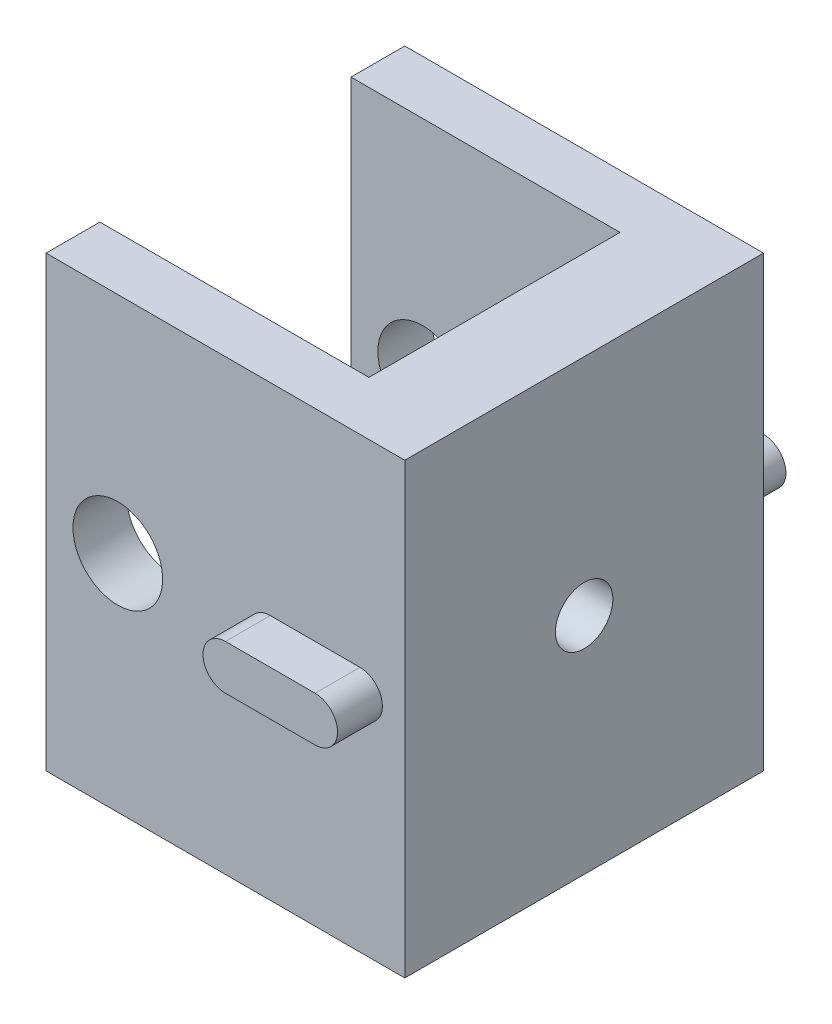
ISO-10303-21;
HEADER;
FILE_DESCRIPTION(('STEP AP214'),'2;1');
FILE_NAME('part.step','',(''),(''),'','','');
FILE_SCHEMA(('AUTOMOTIVE_DESIGN { 1 0 10303 214 1 1 1 1 }'));
ENDSEC;
DATA;
#1=APPLICATION_CONTEXT('core data for automotive mechanical design processes');
#2=APPLICATION_PROTOCOL_DEFINITION('international standard','automotive_design',2000,#1);
#3=PRODUCT_CONTEXT('',#1,'mechanical');
#4=PRODUCT('Part','Part','',(#3));
#5=PRODUCT_RELATED_PRODUCT_CATEGORY('part','',(#4));
#6=PRODUCT_DEFINITION_FORMATION('','',#4);
#7=PRODUCT_DEFINITION_CONTEXT('part definition',#1,'design');
#8=PRODUCT_DEFINITION('design','',#6,#7);
#9=PRODUCT_DEFINITION_SHAPE('','',#8);
#10=(LENGTH_UNIT() NAMED_UNIT(*) SI_UNIT(.MILLI.,.METRE.));
#11=(NAMED_UNIT(*) PLANE_ANGLE_UNIT() SI_UNIT($,.RADIAN.));
#12=(NAMED_UNIT(*) SI_UNIT($,.STERADIAN.) SOLID_ANGLE_UNIT());
#13=UNCERTAINTY_MEASURE_WITH_UNIT(LENGTH_MEASURE(1.E-05),#10,'distance_accuracy_value','');
#14=(GEOMETRIC_REPRESENTATION_CONTEXT(3) GLOBAL_UNCERTAINTY_ASSIGNED_CONTEXT((#13)) GLOBAL_UNIT_ASSIGNED_CONTEXT((#10,
#11,#12)) REPRESENTATION_CONTEXT('',''));
#15=CARTESIAN_POINT('',(0.,0.,0.));
#16=DIRECTION('',(0.,0.,1.));
#17=DIRECTION('',(1.,0.,0.));
#18=AXIS2_PLACEMENT_3D('',#15,#16,#17);
#19=CARTESIAN_POINT('',(-15.,25.,-10.));
#20=DIRECTION('',(0.,0.,1.));
#21=DIRECTION('',(1.,0.,0.));
#22=AXIS2_PLACEMENT_3D('',#19,#20,#21);
#23=PLANE('',#22);
#24=CARTESIAN_POINT('',(-11.,12.5,-10.));
#25=DIRECTION('',(0.,0.,-1.));
#26=DIRECTION('',(-1.,0.,0.));
#27=AXIS2_PLACEMENT_3D('',#24,#25,#26);
#28=CIRCLE('',#27,2.5);
#29=CARTESIAN_POINT('',(-13.5,12.5,-10.));
#30=VERTEX_POINT('',#29);
#31=EDGE_CURVE('E493',#30,#30,#28,.T.);
#32=ORIENTED_EDGE('',*,*,#31,.F.);
#33=EDGE_LOOP('',(#32));
#34=FACE_BOUND('',#33,.T.);
#35=DIRECTION('',(-1.,0.,0.));
#36=VECTOR('',#35,1.);
#37=CARTESIAN_POINT('',(-15.,0.,-10.));
#38=LINE('',#37,#36);
#39=CARTESIAN_POINT('',(5.,0.,-10.));
#40=VERTEX_POINT('',#39);
#41=CARTESIAN_POINT('',(-15.,0.,-10.));
#42=VERTEX_POINT('',#41);
#43=EDGE_CURVE('E344',#40,#42,#38,.T.);
#44=ORIENTED_EDGE('',*,*,#43,.T.);
#45=DIRECTION('',(0.,-1.,0.));
#46=VECTOR('',#45,1.);
#47=CARTESIAN_POINT('',(-15.,25.,-10.));
#48=LINE('',#47,#46);
#49=CARTESIAN_POINT('',(-15.,25.,-10.));
#50=VERTEX_POINT('',#49);
#51=EDGE_CURVE('E11',#50,#42,#48,.T.);
#52=ORIENTED_EDGE('',*,*,#51,.F.);
#53=DIRECTION('',(-1.,0.,0.));
#54=VECTOR('',#53,1.);
#55=CARTESIAN_POINT('',(-15.,25.,-10.));
#56=LINE('',#55,#54);
#57=CARTESIAN_POINT('',(5.,25.,-10.));
#58=VERTEX_POINT('',#57);
#59=EDGE_CURVE('E360',#58,#50,#56,.T.);
#60=ORIENTED_EDGE('',*,*,#59,.F.);
#61=DIRECTION('',(0.,-1.,0.));
#62=VECTOR('',#61,1.);
#63=CARTESIAN_POINT('',(5.,25.,-10.));
#64=LINE('',#63,#62);
#65=EDGE_CURVE('E386',#58,#40,#64,.T.);
#66=ORIENTED_EDGE('',*,*,#65,.T.);
#67=EDGE_LOOP('',(#44,#52,#60,#66));
#68=FACE_BOUND('',#67,.T.);
#69=CARTESIAN_POINT('',(2.5,12.5,-10.));
#70=DIRECTION('',(0.,0.,-1.));
#71=DIRECTION('',(-1.,0.,0.));
#72=AXIS2_PLACEMENT_3D('',#69,#70,#71);
#73=CIRCLE('',#72,1.25);
#74=CARTESIAN_POINT('',(2.5,13.75,-10.));
#75=VERTEX_POINT('',#74);
#76=CARTESIAN_POINT('',(2.5,11.25,-10.));
#77=VERTEX_POINT('',#76);
#78=EDGE_CURVE('E201',#75,#77,#73,.T.);
#79=ORIENTED_EDGE('',*,*,#78,.F.);
#80=DIRECTION('',(1.,0.,0.));
#81=VECTOR('',#80,1.);
#82=CARTESIAN_POINT('',(2.5,13.75,-10.));
#83=LINE('',#82,#81);
#84=CARTESIAN_POINT('',(-2.5,13.75,-10.));
#85=VERTEX_POINT('',#84);
#86=EDGE_CURVE('E249',#85,#75,#83,.T.);
#87=ORIENTED_EDGE('',*,*,#86,.F.);
#88=CARTESIAN_POINT('',(-2.5,12.5,-10.));
#89=DIRECTION('',(0.,0.,-1.));
#90=DIRECTION('',(-1.,0.,0.));
#91=AXIS2_PLACEMENT_3D('',#88,#89,#90);
#92=CIRCLE('',#91,1.25);
#93=CARTESIAN_POINT('',(-2.5,11.25,-10.));
#94=VERTEX_POINT('',#93);
#95=EDGE_CURVE('E264',#94,#85,#92,.T.);
#96=ORIENTED_EDGE('',*,*,#95,.F.);
#97=DIRECTION('',(-1.,0.,0.));
#98=VECTOR('',#97,1.);
#99=CARTESIAN_POINT('',(2.5,11.25,-10.));
#100=LINE('',#99,#98);
#101=EDGE_CURVE('E63',#77,#94,#100,.T.);
#102=ORIENTED_EDGE('',*,*,#101,.F.);
#103=EDGE_LOOP('',(#79,#87,#96,#102));
#104=FACE_BOUND('',#103,.T.);
#105=ADVANCED_FACE('F39',(#34,#68,#104),#23,.F.);
#106=CARTESIAN_POINT('',(-15.,25.,-7.));
#107=DIRECTION('',(1.,0.,0.));
#108=DIRECTION('',(0.,0.,-1.));
#109=AXIS2_PLACEMENT_3D('',#106,#107,#108);
#110=PLANE('',#109);
#111=DIRECTION('',(0.,0.,1.));
#112=VECTOR('',#111,1.);
#113=CARTESIAN_POINT('',(-15.,0.,-7.));
#114=LINE('',#113,#112);
#115=CARTESIAN_POINT('',(-15.,0.,-7.));
#116=VERTEX_POINT('',#115);
#117=EDGE_CURVE('E390',#42,#116,#114,.T.);
#118=ORIENTED_EDGE('',*,*,#117,.T.);
#119=DIRECTION('',(0.,-1.,0.));
#120=VECTOR('',#119,1.);
#121=CARTESIAN_POINT('',(-15.,25.,-7.));
#122=LINE('',#121,#120);
#123=CARTESIAN_POINT('',(-15.,25.,-7.));
#124=VERTEX_POINT('',#123);
#125=EDGE_CURVE('E48',#124,#116,#122,.T.);
#126=ORIENTED_EDGE('',*,*,#125,.F.);
#127=DIRECTION('',(0.,0.,1.));
#128=VECTOR('',#127,1.);
#129=CARTESIAN_POINT('',(-15.,25.,-7.));
#130=LINE('',#129,#128);
#131=EDGE_CURVE('E364',#50,#124,#130,.T.);
#132=ORIENTED_EDGE('',*,*,#131,.F.);
#133=ORIENTED_EDGE('',*,*,#51,.T.);
#134=EDGE_LOOP('',(#118,#126,#132,#133));
#135=FACE_BOUND('',#134,.T.);
#136=ADVANCED_FACE('F462',(#135),#110,.F.);
#137=CARTESIAN_POINT('',(0.,25.,-7.));
#138=DIRECTION('',(0.,0.,-1.));
#139=DIRECTION('',(-1.,0.,0.));
#140=AXIS2_PLACEMENT_3D('',#137,#138,#139);
#141=PLANE('',#140);
#142=CARTESIAN_POINT('',(-11.,12.5,-7.));
#143=DIRECTION('',(0.,0.,-1.));
#144=DIRECTION('',(-1.,0.,0.));
#145=AXIS2_PLACEMENT_3D('',#142,#143,#144);
#146=CIRCLE('',#145,2.5);
#147=CARTESIAN_POINT('',(-13.5,12.5,-7.));
#148=VERTEX_POINT('',#147);
#149=EDGE_CURVE('E229',#148,#148,#146,.T.);
#150=ORIENTED_EDGE('',*,*,#149,.T.);
#151=EDGE_LOOP('',(#150));
#152=FACE_BOUND('',#151,.T.);
#153=DIRECTION('',(1.,0.,0.));
#154=VECTOR('',#153,1.);
#155=CARTESIAN_POINT('',(0.,0.,-7.));
#156=LINE('',#155,#154);
#157=CARTESIAN_POINT('',(0.,0.,-7.));
#158=VERTEX_POINT('',#157);
#159=EDGE_CURVE('E393',#116,#158,#156,.T.);
#160=ORIENTED_EDGE('',*,*,#159,.T.);
#161=DIRECTION('',(0.,-1.,0.));
#162=VECTOR('',#161,1.);
#163=CARTESIAN_POINT('',(0.,25.,-7.));
#164=LINE('',#163,#162);
#165=CARTESIAN_POINT('',(0.,25.,-7.));
#166=VERTEX_POINT('',#165);
#167=EDGE_CURVE('E429',#166,#158,#164,.T.);
#168=ORIENTED_EDGE('',*,*,#167,.F.);
#169=DIRECTION('',(1.,0.,0.));
#170=VECTOR('',#169,1.);
#171=CARTESIAN_POINT('',(0.,25.,-7.));
#172=LINE('',#171,#170);
#173=EDGE_CURVE('E368',#124,#166,#172,.T.);
#174=ORIENTED_EDGE('',*,*,#173,.F.);
#175=ORIENTED_EDGE('',*,*,#125,.T.);
#176=EDGE_LOOP('',(#160,#168,#174,#175));
#177=FACE_BOUND('',#176,.T.);
#178=ADVANCED_FACE('F439',(#152,#177),#141,.F.);
#179=CARTESIAN_POINT('',(0.,25.,-7.));
#180=DIRECTION('',(1.,0.,0.));
#181=DIRECTION('',(0.,0.,-1.));
#182=AXIS2_PLACEMENT_3D('',#179,#180,#181);
#183=PLANE('',#182);
#184=DIRECTION('',(0.,0.5,-0.866025403784439));
#185=VECTOR('',#184,1.);
#186=CARTESIAN_POINT('',(0.,14.2320508075689,3.));
#187=LINE('',#186,#185);
#188=CARTESIAN_POINT('',(0.,14.2320508075689,3.));
#189=VERTEX_POINT('',#188);
#190=CARTESIAN_POINT('',(0.,15.9641016151378,0.));
#191=VERTEX_POINT('',#190);
#192=EDGE_CURVE('E322',#189,#191,#187,.T.);
#193=ORIENTED_EDGE('',*,*,#192,.F.);
#194=DIRECTION('',(0.,1.,0.));
#195=VECTOR('',#194,1.);
#196=CARTESIAN_POINT('',(0.,10.7679491924311,3.));
#197=LINE('',#196,#195);
#198=CARTESIAN_POINT('',(0.,10.7679491924311,3.));
#199=VERTEX_POINT('',#198);
#200=EDGE_CURVE('E290',#199,#189,#197,.T.);
#201=ORIENTED_EDGE('',*,*,#200,.F.);
#202=DIRECTION('',(0.,0.5,0.866025403784438));
#203=VECTOR('',#202,1.);
#204=CARTESIAN_POINT('',(0.,9.03589838486225,0.));
#205=LINE('',#204,#203);
#206=CARTESIAN_POINT('',(0.,9.03589838486225,0.));
#207=VERTEX_POINT('',#206);
#208=EDGE_CURVE('E299',#207,#199,#205,.T.);
#209=ORIENTED_EDGE('',*,*,#208,.F.);
#210=DIRECTION('',(0.,-0.5,0.866025403784439));
#211=VECTOR('',#210,1.);
#212=CARTESIAN_POINT('',(0.,10.7679491924311,-3.));
#213=LINE('',#212,#211);
#214=CARTESIAN_POINT('',(0.,10.7679491924311,-3.));
#215=VERTEX_POINT('',#214);
#216=EDGE_CURVE('E334',#215,#207,#213,.T.);
#217=ORIENTED_EDGE('',*,*,#216,.F.);
#218=DIRECTION('',(0.,-1.,0.));
#219=VECTOR('',#218,1.);
#220=CARTESIAN_POINT('',(0.,14.2320508075689,-3.));
#221=LINE('',#220,#219);
#222=CARTESIAN_POINT('',(0.,14.2320508075689,-3.));
#223=VERTEX_POINT('',#222);
#224=EDGE_CURVE('E330',#223,#215,#221,.T.);
#225=ORIENTED_EDGE('',*,*,#224,.F.);
#226=DIRECTION('',(0.,-0.5,-0.866025403784439));
#227=VECTOR('',#226,1.);
#228=CARTESIAN_POINT('',(0.,15.9641016151378,0.));
#229=LINE('',#228,#227);
#230=EDGE_CURVE('E326',#191,#223,#229,.T.);
#231=ORIENTED_EDGE('',*,*,#230,.F.);
#232=EDGE_LOOP('',(#193,#201,#209,#217,#225,#231));
#233=FACE_BOUND('',#232,.T.);
#234=DIRECTION('',(0.,0.,1.));
#235=VECTOR('',#234,1.);
#236=CARTESIAN_POINT('',(0.,0.,-7.));
#237=LINE('',#236,#235);
#238=CARTESIAN_POINT('',(0.,0.,7.));
#239=VERTEX_POINT('',#238);
#240=EDGE_CURVE('E396',#158,#239,#237,.T.);
#241=ORIENTED_EDGE('',*,*,#240,.T.);
#242=DIRECTION('',(0.,-1.,0.));
#243=VECTOR('',#242,1.);
#244=CARTESIAN_POINT('',(0.,25.,7.));
#245=LINE('',#244,#243);
#246=CARTESIAN_POINT('',(0.,25.,7.));
#247=VERTEX_POINT('',#246);
#248=EDGE_CURVE('E425',#247,#239,#245,.T.);
#249=ORIENTED_EDGE('',*,*,#248,.F.);
#250=DIRECTION('',(0.,0.,1.));
#251=VECTOR('',#250,1.);
#252=CARTESIAN_POINT('',(0.,25.,-7.));
#253=LINE('',#252,#251);
#254=EDGE_CURVE('E371',#166,#247,#253,.T.);
#255=ORIENTED_EDGE('',*,*,#254,.F.);
#256=ORIENTED_EDGE('',*,*,#167,.T.);
#257=EDGE_LOOP('',(#241,#249,#255,#256));
#258=FACE_BOUND('',#257,.T.);
#259=ADVANCED_FACE('F450',(#233,#258),#183,.F.);
#260=CARTESIAN_POINT('',(-15.,25.,7.));
#261=DIRECTION('',(0.,0.,1.));
#262=DIRECTION('',(1.,0.,0.));
#263=AXIS2_PLACEMENT_3D('',#260,#261,#262);
#264=PLANE('',#263);
#265=CARTESIAN_POINT('',(-11.,12.5,7.));
#266=DIRECTION('',(0.,0.,1.));
#267=DIRECTION('',(1.,0.,0.));
#268=AXIS2_PLACEMENT_3D('',#265,#266,#267);
#269=CIRCLE('',#268,2.5);
#270=CARTESIAN_POINT('',(-8.5,12.5,7.));
#271=VERTEX_POINT('',#270);
#272=EDGE_CURVE('E499',#271,#271,#269,.T.);
#273=ORIENTED_EDGE('',*,*,#272,.T.);
#274=EDGE_LOOP('',(#273));
#275=FACE_BOUND('',#274,.T.);
#276=DIRECTION('',(-1.,0.,0.));
#277=VECTOR('',#276,1.);
#278=CARTESIAN_POINT('',(-15.,0.,7.));
#279=LINE('',#278,#277);
#280=CARTESIAN_POINT('',(-15.,0.,7.));
#281=VERTEX_POINT('',#280);
#282=EDGE_CURVE('E399',#239,#281,#279,.T.);
#283=ORIENTED_EDGE('',*,*,#282,.T.);
#284=DIRECTION('',(0.,-1.,0.));
#285=VECTOR('',#284,1.);
#286=CARTESIAN_POINT('',(-15.,25.,7.));
#287=LINE('',#286,#285);
#288=CARTESIAN_POINT('',(-15.,25.,7.));
#289=VERTEX_POINT('',#288);
#290=EDGE_CURVE('E421',#289,#281,#287,.T.);
#291=ORIENTED_EDGE('',*,*,#290,.F.);
#292=DIRECTION('',(-1.,0.,0.));
#293=VECTOR('',#292,1.);
#294=CARTESIAN_POINT('',(-15.,25.,7.));
#295=LINE('',#294,#293);
#296=EDGE_CURVE('E374',#247,#289,#295,.T.);
#297=ORIENTED_EDGE('',*,*,#296,.F.);
#298=ORIENTED_EDGE('',*,*,#248,.T.);
#299=EDGE_LOOP('',(#283,#291,#297,#298));
#300=FACE_BOUND('',#299,.T.);
#301=ADVANCED_FACE('F454',(#275,#300),#264,.F.);
#302=CARTESIAN_POINT('',(-15.,25.,10.));
#303=DIRECTION('',(1.,0.,0.));
#304=DIRECTION('',(0.,0.,-1.));
#305=AXIS2_PLACEMENT_3D('',#302,#303,#304);
#306=PLANE('',#305);
#307=DIRECTION('',(0.,0.,1.));
#308=VECTOR('',#307,1.);
#309=CARTESIAN_POINT('',(-15.,0.,10.));
#310=LINE('',#309,#308);
#311=CARTESIAN_POINT('',(-15.,0.,10.));
#312=VERTEX_POINT('',#311);
#313=EDGE_CURVE('E402',#281,#312,#310,.T.);
#314=ORIENTED_EDGE('',*,*,#313,.T.);
#315=DIRECTION('',(0.,-1.,0.));
#316=VECTOR('',#315,1.);
#317=CARTESIAN_POINT('',(-15.,25.,10.));
#318=LINE('',#317,#316);
#319=CARTESIAN_POINT('',(-15.,25.,10.));
#320=VERTEX_POINT('',#319);
#321=EDGE_CURVE('E417',#320,#312,#318,.T.);
#322=ORIENTED_EDGE('',*,*,#321,.F.);
#323=DIRECTION('',(0.,0.,1.));
#324=VECTOR('',#323,1.);
#325=CARTESIAN_POINT('',(-15.,25.,10.));
#326=LINE('',#325,#324);
#327=EDGE_CURVE('E377',#289,#320,#326,.T.);
#328=ORIENTED_EDGE('',*,*,#327,.F.);
#329=ORIENTED_EDGE('',*,*,#290,.T.);
#330=EDGE_LOOP('',(#314,#322,#328,#329));
#331=FACE_BOUND('',#330,.T.);
#332=ADVANCED_FACE('F475',(#331),#306,.F.);
#333=CARTESIAN_POINT('',(5.,25.,10.));
#334=DIRECTION('',(0.,0.,-1.));
#335=DIRECTION('',(-1.,0.,0.));
#336=AXIS2_PLACEMENT_3D('',#333,#334,#335);
#337=PLANE('',#336);
#338=CARTESIAN_POINT('',(-11.,12.5,10.));
#339=DIRECTION('',(0.,0.,-1.));
#340=DIRECTION('',(-1.,0.,0.));
#341=AXIS2_PLACEMENT_3D('',#338,#339,#340);
#342=CIRCLE('',#341,2.5);
#343=CARTESIAN_POINT('',(-13.5,12.5,10.));
#344=VERTEX_POINT('',#343);
#345=EDGE_CURVE('E42',#344,#344,#342,.T.);
#346=ORIENTED_EDGE('',*,*,#345,.T.);
#347=EDGE_LOOP('',(#346));
#348=FACE_BOUND('',#347,.T.);
#349=DIRECTION('',(1.,0.,0.));
#350=VECTOR('',#349,1.);
#351=CARTESIAN_POINT('',(2.50000000000001,13.75,10.));
#352=LINE('',#351,#350);
#353=CARTESIAN_POINT('',(-2.5,13.75,10.));
#354=VERTEX_POINT('',#353);
#355=CARTESIAN_POINT('',(2.50000000000001,13.75,10.));
#356=VERTEX_POINT('',#355);
#357=EDGE_CURVE('E228',#354,#356,#352,.T.);
#358=ORIENTED_EDGE('',*,*,#357,.T.);
#359=CARTESIAN_POINT('',(2.5,12.5,10.));
#360=DIRECTION('',(0.,0.,-1.));
#361=DIRECTION('',(-1.,0.,0.));
#362=AXIS2_PLACEMENT_3D('',#359,#360,#361);
#363=CIRCLE('',#362,1.25);
#364=CARTESIAN_POINT('',(2.50000000000001,11.25,10.));
#365=VERTEX_POINT('',#364);
#366=EDGE_CURVE('E195',#356,#365,#363,.T.);
#367=ORIENTED_EDGE('',*,*,#366,.T.);
#368=DIRECTION('',(-1.,0.,0.));
#369=VECTOR('',#368,1.);
#370=CARTESIAN_POINT('',(2.50000000000001,11.25,10.));
#371=LINE('',#370,#369);
#372=CARTESIAN_POINT('',(-2.5,11.25,10.));
#373=VERTEX_POINT('',#372);
#374=EDGE_CURVE('E213',#365,#373,#371,.T.);
#375=ORIENTED_EDGE('',*,*,#374,.T.);
#376=CARTESIAN_POINT('',(-2.5,12.5,10.));
#377=DIRECTION('',(0.,0.,-1.));
#378=DIRECTION('',(-1.,0.,0.));
#379=AXIS2_PLACEMENT_3D('',#376,#377,#378);
#380=CIRCLE('',#379,1.25);
#381=EDGE_CURVE('E55',#373,#354,#380,.T.);
#382=ORIENTED_EDGE('',*,*,#381,.T.);
#383=EDGE_LOOP('',(#358,#367,#375,#382));
#384=FACE_BOUND('',#383,.T.);
#385=DIRECTION('',(1.,0.,0.));
#386=VECTOR('',#385,1.);
#387=CARTESIAN_POINT('',(5.,0.,10.));
#388=LINE('',#387,#386);
#389=CARTESIAN_POINT('',(5.,0.,10.));
#390=VERTEX_POINT('',#389);
#391=EDGE_CURVE('E405',#312,#390,#388,.T.);
#392=ORIENTED_EDGE('',*,*,#391,.T.);
#393=DIRECTION('',(0.,-1.,0.));
#394=VECTOR('',#393,1.);
#395=CARTESIAN_POINT('',(5.,25.,10.));
#396=LINE('',#395,#394);
#397=CARTESIAN_POINT('',(5.,25.,10.));
#398=VERTEX_POINT('',#397);
#399=EDGE_CURVE('E413',#398,#390,#396,.T.);
#400=ORIENTED_EDGE('',*,*,#399,.F.);
#401=DIRECTION('',(1.,0.,0.));
#402=VECTOR('',#401,1.);
#403=CARTESIAN_POINT('',(5.,25.,10.));
#404=LINE('',#403,#402);
#405=EDGE_CURVE('E380',#320,#398,#404,.T.);
#406=ORIENTED_EDGE('',*,*,#405,.F.);
#407=ORIENTED_EDGE('',*,*,#321,.T.);
#408=EDGE_LOOP('',(#392,#400,#406,#407));
#409=FACE_BOUND('',#408,.T.);
#410=ADVANCED_FACE('F473',(#348,#384,#409),#337,.F.);
#411=CARTESIAN_POINT('',(5.,25.,-10.));
#412=DIRECTION('',(-1.,0.,0.));
#413=DIRECTION('',(0.,0.,1.));
#414=AXIS2_PLACEMENT_3D('',#411,#412,#413);
#415=PLANE('',#414);
#416=CARTESIAN_POINT('',(5.,12.5,0.));
#417=DIRECTION('',(-1.,0.,0.));
#418=DIRECTION('',(0.,0.,1.));
#419=AXIS2_PLACEMENT_3D('',#416,#417,#418);
#420=CIRCLE('',#419,1.6);
#421=CARTESIAN_POINT('',(5.,12.5,1.6));
#422=VERTEX_POINT('',#421);
#423=EDGE_CURVE('E286',#422,#422,#420,.T.);
#424=ORIENTED_EDGE('',*,*,#423,.T.);
#425=EDGE_LOOP('',(#424));
#426=FACE_BOUND('',#425,.T.);
#427=DIRECTION('',(0.,0.,-1.));
#428=VECTOR('',#427,1.);
#429=CARTESIAN_POINT('',(5.,0.,-10.));
#430=LINE('',#429,#428);
#431=EDGE_CURVE('E365',#390,#40,#430,.T.);
#432=ORIENTED_EDGE('',*,*,#431,.T.);
#433=ORIENTED_EDGE('',*,*,#65,.F.);
#434=DIRECTION('',(0.,0.,-1.));
#435=VECTOR('',#434,1.);
#436=CARTESIAN_POINT('',(5.,25.,-10.));
#437=LINE('',#436,#435);
#438=EDGE_CURVE('E383',#398,#58,#437,.T.);
#439=ORIENTED_EDGE('',*,*,#438,.F.);
#440=ORIENTED_EDGE('',*,*,#399,.T.);
#441=EDGE_LOOP('',(#432,#433,#439,#440));
#442=FACE_BOUND('',#441,.T.);
#443=ADVANCED_FACE('F468',(#426,#442),#415,.F.);
#444=CARTESIAN_POINT('',(0.,25.,0.));
#445=DIRECTION('',(0.,-1.,0.));
#446=DIRECTION('',(0.,0.,-1.));
#447=AXIS2_PLACEMENT_3D('',#444,#445,#446);
#448=PLANE('',#447);
#449=ORIENTED_EDGE('',*,*,#59,.T.);
#450=ORIENTED_EDGE('',*,*,#131,.T.);
#451=ORIENTED_EDGE('',*,*,#173,.T.);
#452=ORIENTED_EDGE('',*,*,#254,.T.);
#453=ORIENTED_EDGE('',*,*,#296,.T.);
#454=ORIENTED_EDGE('',*,*,#327,.T.);
#455=ORIENTED_EDGE('',*,*,#405,.T.);
#456=ORIENTED_EDGE('',*,*,#438,.T.);
#457=EDGE_LOOP('',(#449,#450,#451,#452,#453,#454,#455,#456));
#458=FACE_BOUND('',#457,.T.);
#459=ADVANCED_FACE('F458',(#458),#448,.F.);
#460=CARTESIAN_POINT('',(0.,0.,0.));
#461=DIRECTION('',(0.,-1.,0.));
#462=DIRECTION('',(0.,0.,-1.));
#463=AXIS2_PLACEMENT_3D('',#460,#461,#462);
#464=PLANE('',#463);
#465=ORIENTED_EDGE('',*,*,#43,.F.);
#466=ORIENTED_EDGE('',*,*,#431,.F.);
#467=ORIENTED_EDGE('',*,*,#391,.F.);
#468=ORIENTED_EDGE('',*,*,#313,.F.);
#469=ORIENTED_EDGE('',*,*,#282,.F.);
#470=ORIENTED_EDGE('',*,*,#240,.F.);
#471=ORIENTED_EDGE('',*,*,#159,.F.);
#472=ORIENTED_EDGE('',*,*,#117,.F.);
#473=EDGE_LOOP('',(#465,#466,#467,#468,#469,#470,#471,#472));
#474=FACE_BOUND('',#473,.T.);
#475=ADVANCED_FACE('F445',(#474),#464,.T.);
#476=CARTESIAN_POINT('',(2.5,10.7679491924311,3.));
#477=DIRECTION('',(0.,0.,1.));
#478=DIRECTION('',(0.,-1.,0.));
#479=AXIS2_PLACEMENT_3D('',#476,#477,#478);
#480=PLANE('',#479);
#481=ORIENTED_EDGE('',*,*,#200,.T.);
#482=DIRECTION('',(-1.,0.,0.));
#483=VECTOR('',#482,1.);
#484=CARTESIAN_POINT('',(2.5,14.2320508075689,3.));
#485=LINE('',#484,#483);
#486=CARTESIAN_POINT('',(2.5,14.2320508075689,3.));
#487=VERTEX_POINT('',#486);
#488=EDGE_CURVE('E319',#487,#189,#485,.T.);
#489=ORIENTED_EDGE('',*,*,#488,.F.);
#490=DIRECTION('',(0.,1.,0.));
#491=VECTOR('',#490,1.);
#492=CARTESIAN_POINT('',(2.5,10.7679491924311,3.));
#493=LINE('',#492,#491);
#494=CARTESIAN_POINT('',(2.5,10.7679491924311,3.));
#495=VERTEX_POINT('',#494);
#496=EDGE_CURVE('E294',#495,#487,#493,.T.);
#497=ORIENTED_EDGE('',*,*,#496,.F.);
#498=DIRECTION('',(-1.,0.,0.));
#499=VECTOR('',#498,1.);
#500=CARTESIAN_POINT('',(2.5,10.7679491924311,3.));
#501=LINE('',#500,#499);
#502=EDGE_CURVE('E341',#495,#199,#501,.T.);
#503=ORIENTED_EDGE('',*,*,#502,.T.);
#504=EDGE_LOOP('',(#481,#489,#497,#503));
#505=FACE_BOUND('',#504,.T.);
#506=ADVANCED_FACE('F563',(#505),#480,.F.);
#507=CARTESIAN_POINT('',(2.5,9.03589838486225,0.));
#508=DIRECTION('',(0.,-0.866025403784438,0.5));
#509=DIRECTION('',(0.,-0.5,-0.866025403784439));
#510=AXIS2_PLACEMENT_3D('',#507,#508,#509);
#511=PLANE('',#510);
#512=ORIENTED_EDGE('',*,*,#208,.T.);
#513=ORIENTED_EDGE('',*,*,#502,.F.);
#514=DIRECTION('',(0.,0.5,0.866025403784438));
#515=VECTOR('',#514,1.);
#516=CARTESIAN_POINT('',(2.5,9.03589838486225,0.));
#517=LINE('',#516,#515);
#518=CARTESIAN_POINT('',(2.5,9.03589838486225,0.));
#519=VERTEX_POINT('',#518);
#520=EDGE_CURVE('E315',#519,#495,#517,.T.);
#521=ORIENTED_EDGE('',*,*,#520,.F.);
#522=DIRECTION('',(-1.,0.,0.));
#523=VECTOR('',#522,1.);
#524=CARTESIAN_POINT('',(2.5,9.03589838486225,0.));
#525=LINE('',#524,#523);
#526=EDGE_CURVE('E345',#519,#207,#525,.T.);
#527=ORIENTED_EDGE('',*,*,#526,.T.);
#528=EDGE_LOOP('',(#512,#513,#521,#527));
#529=FACE_BOUND('',#528,.T.);
#530=ADVANCED_FACE('F559',(#529),#511,.F.);
#531=CARTESIAN_POINT('',(2.5,10.7679491924311,-3.));
#532=DIRECTION('',(0.,-0.866025403784439,-0.5));
#533=DIRECTION('',(0.,0.5,-0.866025403784439));
#534=AXIS2_PLACEMENT_3D('',#531,#532,#533);
#535=PLANE('',#534);
#536=ORIENTED_EDGE('',*,*,#216,.T.);
#537=ORIENTED_EDGE('',*,*,#526,.F.);
#538=DIRECTION('',(0.,-0.5,0.866025403784439));
#539=VECTOR('',#538,1.);
#540=CARTESIAN_POINT('',(2.5,10.7679491924311,-3.));
#541=LINE('',#540,#539);
#542=CARTESIAN_POINT('',(2.5,10.7679491924311,-3.));
#543=VERTEX_POINT('',#542);
#544=EDGE_CURVE('E311',#543,#519,#541,.T.);
#545=ORIENTED_EDGE('',*,*,#544,.F.);
#546=DIRECTION('',(-1.,0.,0.));
#547=VECTOR('',#546,1.);
#548=CARTESIAN_POINT('',(2.5,10.7679491924311,-3.));
#549=LINE('',#548,#547);
#550=EDGE_CURVE('E348',#543,#215,#549,.T.);
#551=ORIENTED_EDGE('',*,*,#550,.T.);
#552=EDGE_LOOP('',(#536,#537,#545,#551));
#553=FACE_BOUND('',#552,.T.);
#554=ADVANCED_FACE('F562',(#553),#535,.F.);
#555=CARTESIAN_POINT('',(2.5,14.2320508075689,-3.));
#556=DIRECTION('',(0.,0.,-1.));
#557=DIRECTION('',(-1.,0.,0.));
#558=AXIS2_PLACEMENT_3D('',#555,#556,#557);
#559=PLANE('',#558);
#560=ORIENTED_EDGE('',*,*,#224,.T.);
#561=ORIENTED_EDGE('',*,*,#550,.F.);
#562=DIRECTION('',(0.,-1.,0.));
#563=VECTOR('',#562,1.);
#564=CARTESIAN_POINT('',(2.5,14.2320508075689,-3.));
#565=LINE('',#564,#563);
#566=CARTESIAN_POINT('',(2.5,14.2320508075689,-3.));
#567=VERTEX_POINT('',#566);
#568=EDGE_CURVE('E307',#567,#543,#565,.T.);
#569=ORIENTED_EDGE('',*,*,#568,.F.);
#570=DIRECTION('',(-1.,0.,0.));
#571=VECTOR('',#570,1.);
#572=CARTESIAN_POINT('',(2.5,14.2320508075689,-3.));
#573=LINE('',#572,#571);
#574=EDGE_CURVE('E351',#567,#223,#573,.T.);
#575=ORIENTED_EDGE('',*,*,#574,.T.);
#576=EDGE_LOOP('',(#560,#561,#569,#575));
#577=FACE_BOUND('',#576,.T.);
#578=ADVANCED_FACE('F567',(#577),#559,.F.);
#579=CARTESIAN_POINT('',(2.5,15.9641016151378,0.));
#580=DIRECTION('',(0.,0.866025403784439,-0.5));
#581=DIRECTION('',(0.,0.5,0.866025403784439));
#582=AXIS2_PLACEMENT_3D('',#579,#580,#581);
#583=PLANE('',#582);
#584=ORIENTED_EDGE('',*,*,#230,.T.);
#585=ORIENTED_EDGE('',*,*,#574,.F.);
#586=DIRECTION('',(0.,-0.5,-0.866025403784439));
#587=VECTOR('',#586,1.);
#588=CARTESIAN_POINT('',(2.5,15.9641016151378,0.));
#589=LINE('',#588,#587);
#590=CARTESIAN_POINT('',(2.5,15.9641016151378,0.));
#591=VERTEX_POINT('',#590);
#592=EDGE_CURVE('E303',#591,#567,#589,.T.);
#593=ORIENTED_EDGE('',*,*,#592,.F.);
#594=DIRECTION('',(-1.,0.,0.));
#595=VECTOR('',#594,1.);
#596=CARTESIAN_POINT('',(2.5,15.9641016151378,0.));
#597=LINE('',#596,#595);
#598=EDGE_CURVE('E354',#591,#191,#597,.T.);
#599=ORIENTED_EDGE('',*,*,#598,.T.);
#600=EDGE_LOOP('',(#584,#585,#593,#599));
#601=FACE_BOUND('',#600,.T.);
#602=ADVANCED_FACE('F571',(#601),#583,.F.);
#603=CARTESIAN_POINT('',(2.5,14.2320508075689,3.));
#604=DIRECTION('',(0.,0.866025403784439,0.5));
#605=DIRECTION('',(0.,-0.5,0.866025403784439));
#606=AXIS2_PLACEMENT_3D('',#603,#604,#605);
#607=PLANE('',#606);
#608=ORIENTED_EDGE('',*,*,#192,.T.);
#609=ORIENTED_EDGE('',*,*,#598,.F.);
#610=DIRECTION('',(0.,0.5,-0.866025403784439));
#611=VECTOR('',#610,1.);
#612=CARTESIAN_POINT('',(2.5,14.2320508075689,3.));
#613=LINE('',#612,#611);
#614=EDGE_CURVE('E298',#487,#591,#613,.T.);
#615=ORIENTED_EDGE('',*,*,#614,.F.);
#616=ORIENTED_EDGE('',*,*,#488,.T.);
#617=EDGE_LOOP('',(#608,#609,#615,#616));
#618=FACE_BOUND('',#617,.T.);
#619=ADVANCED_FACE('F557',(#618),#607,.F.);
#620=CARTESIAN_POINT('',(2.5,0.,0.));
#621=DIRECTION('',(-1.,0.,0.));
#622=DIRECTION('',(0.,0.,1.));
#623=AXIS2_PLACEMENT_3D('',#620,#621,#622);
#624=PLANE('',#623);
#625=CARTESIAN_POINT('',(2.5,12.5,0.));
#626=DIRECTION('',(-1.,0.,0.));
#627=DIRECTION('',(0.,0.,1.));
#628=AXIS2_PLACEMENT_3D('',#625,#626,#627);
#629=CIRCLE('',#628,1.6);
#630=CARTESIAN_POINT('',(2.5,12.5,1.6));
#631=VERTEX_POINT('',#630);
#632=EDGE_CURVE('E285',#631,#631,#629,.T.);
#633=ORIENTED_EDGE('',*,*,#632,.F.);
#634=EDGE_LOOP('',(#633));
#635=FACE_BOUND('',#634,.T.);
#636=ORIENTED_EDGE('',*,*,#496,.T.);
#637=ORIENTED_EDGE('',*,*,#614,.T.);
#638=ORIENTED_EDGE('',*,*,#592,.T.);
#639=ORIENTED_EDGE('',*,*,#568,.T.);
#640=ORIENTED_EDGE('',*,*,#544,.T.);
#641=ORIENTED_EDGE('',*,*,#520,.T.);
#642=EDGE_LOOP('',(#636,#637,#638,#639,#640,#641));
#643=FACE_BOUND('',#642,.T.);
#644=ADVANCED_FACE('F553',(#635,#643),#624,.T.);
#645=CARTESIAN_POINT('',(5.,12.5,0.));
#646=DIRECTION('',(-1.,0.,0.));
#647=DIRECTION('',(0.,0.,1.));
#648=AXIS2_PLACEMENT_3D('',#645,#646,#647);
#649=CYLINDRICAL_SURFACE('',#648,1.6);
#650=ORIENTED_EDGE('',*,*,#423,.F.);
#651=EDGE_LOOP('',(#650));
#652=FACE_BOUND('',#651,.T.);
#653=ORIENTED_EDGE('',*,*,#632,.T.);
#654=EDGE_LOOP('',(#653));
#655=FACE_BOUND('',#654,.T.);
#656=ADVANCED_FACE('F549',(#652,#655),#649,.F.);
#657=CARTESIAN_POINT('',(2.5,12.5,-12.5));
#658=DIRECTION('',(0.,0.,1.));
#659=DIRECTION('',(1.,0.,0.));
#660=AXIS2_PLACEMENT_3D('',#657,#658,#659);
#661=CYLINDRICAL_SURFACE('',#660,1.25);
#662=ORIENTED_EDGE('',*,*,#78,.T.);
#663=DIRECTION('',(0.,0.,1.));
#664=VECTOR('',#663,1.);
#665=CARTESIAN_POINT('',(2.5,11.25,-12.5));
#666=LINE('',#665,#664);
#667=CARTESIAN_POINT('',(2.5,11.25,-12.5));
#668=VERTEX_POINT('',#667);
#669=EDGE_CURVE('E282',#668,#77,#666,.T.);
#670=ORIENTED_EDGE('',*,*,#669,.F.);
#671=CARTESIAN_POINT('',(2.5,12.5,-12.5));
#672=DIRECTION('',(0.,0.,-1.));
#673=DIRECTION('',(-1.,0.,0.));
#674=AXIS2_PLACEMENT_3D('',#671,#672,#673);
#675=CIRCLE('',#674,1.25);
#676=CARTESIAN_POINT('',(2.5,13.75,-12.5));
#677=VERTEX_POINT('',#676);
#678=EDGE_CURVE('E244',#677,#668,#675,.T.);
#679=ORIENTED_EDGE('',*,*,#678,.F.);
#680=DIRECTION('',(0.,0.,1.));
#681=VECTOR('',#680,1.);
#682=CARTESIAN_POINT('',(2.5,13.75,-12.5));
#683=LINE('',#682,#681);
#684=EDGE_CURVE('E258',#677,#75,#683,.T.);
#685=ORIENTED_EDGE('',*,*,#684,.T.);
#686=EDGE_LOOP('',(#662,#670,#679,#685));
#687=FACE_BOUND('',#686,.T.);
#688=ADVANCED_FACE('F545',(#687),#661,.T.);
#689=CARTESIAN_POINT('',(2.5,11.25,-12.5));
#690=DIRECTION('',(0.,1.,0.));
#691=DIRECTION('',(0.,0.,1.));
#692=AXIS2_PLACEMENT_3D('',#689,#690,#691);
#693=PLANE('',#692);
#694=ORIENTED_EDGE('',*,*,#101,.T.);
#695=DIRECTION('',(0.,0.,1.));
#696=VECTOR('',#695,1.);
#697=CARTESIAN_POINT('',(-2.5,11.25,-12.5));
#698=LINE('',#697,#696);
#699=CARTESIAN_POINT('',(-2.5,11.25,-12.5));
#700=VERTEX_POINT('',#699);
#701=EDGE_CURVE('E278',#700,#94,#698,.T.);
#702=ORIENTED_EDGE('',*,*,#701,.F.);
#703=DIRECTION('',(-1.,0.,0.));
#704=VECTOR('',#703,1.);
#705=CARTESIAN_POINT('',(2.5,11.25,-12.5));
#706=LINE('',#705,#704);
#707=EDGE_CURVE('E248',#668,#700,#706,.T.);
#708=ORIENTED_EDGE('',*,*,#707,.F.);
#709=ORIENTED_EDGE('',*,*,#669,.T.);
#710=EDGE_LOOP('',(#694,#702,#708,#709));
#711=FACE_BOUND('',#710,.T.);
#712=ADVANCED_FACE('F541',(#711),#693,.F.);
#713=CARTESIAN_POINT('',(-2.5,12.5,-12.5));
#714=DIRECTION('',(0.,0.,1.));
#715=DIRECTION('',(1.,0.,0.));
#716=AXIS2_PLACEMENT_3D('',#713,#714,#715);
#717=CYLINDRICAL_SURFACE('',#716,1.25);
#718=ORIENTED_EDGE('',*,*,#95,.T.);
#719=DIRECTION('',(0.,0.,1.));
#720=VECTOR('',#719,1.);
#721=CARTESIAN_POINT('',(-2.5,13.75,-12.5));
#722=LINE('',#721,#720);
#723=CARTESIAN_POINT('',(-2.5,13.75,-12.5));
#724=VERTEX_POINT('',#723);
#725=EDGE_CURVE('E274',#724,#85,#722,.T.);
#726=ORIENTED_EDGE('',*,*,#725,.F.);
#727=CARTESIAN_POINT('',(-2.5,12.5,-12.5));
#728=DIRECTION('',(0.,0.,-1.));
#729=DIRECTION('',(-1.,0.,0.));
#730=AXIS2_PLACEMENT_3D('',#727,#728,#729);
#731=CIRCLE('',#730,1.25);
#732=EDGE_CURVE('E252',#700,#724,#731,.T.);
#733=ORIENTED_EDGE('',*,*,#732,.F.);
#734=ORIENTED_EDGE('',*,*,#701,.T.);
#735=EDGE_LOOP('',(#718,#726,#733,#734));
#736=FACE_BOUND('',#735,.T.);
#737=ADVANCED_FACE('F537',(#736),#717,.T.);
#738=CARTESIAN_POINT('',(2.5,13.75,-12.5));
#739=DIRECTION('',(0.,-1.,0.));
#740=DIRECTION('',(0.,0.,-1.));
#741=AXIS2_PLACEMENT_3D('',#738,#739,#740);
#742=PLANE('',#741);
#743=ORIENTED_EDGE('',*,*,#86,.T.);
#744=ORIENTED_EDGE('',*,*,#684,.F.);
#745=DIRECTION('',(1.,0.,0.));
#746=VECTOR('',#745,1.);
#747=CARTESIAN_POINT('',(2.5,13.75,-12.5));
#748=LINE('',#747,#746);
#749=EDGE_CURVE('E255',#724,#677,#748,.T.);
#750=ORIENTED_EDGE('',*,*,#749,.F.);
#751=ORIENTED_EDGE('',*,*,#725,.T.);
#752=EDGE_LOOP('',(#743,#744,#750,#751));
#753=FACE_BOUND('',#752,.T.);
#754=ADVANCED_FACE('F533',(#753),#742,.F.);
#755=CARTESIAN_POINT('',(2.5,12.5,-12.5));
#756=DIRECTION('',(0.,0.,-1.));
#757=DIRECTION('',(-1.,0.,0.));
#758=AXIS2_PLACEMENT_3D('',#755,#756,#757);
#759=PLANE('',#758);
#760=ORIENTED_EDGE('',*,*,#678,.T.);
#761=ORIENTED_EDGE('',*,*,#707,.T.);
#762=ORIENTED_EDGE('',*,*,#732,.T.);
#763=ORIENTED_EDGE('',*,*,#749,.T.);
#764=EDGE_LOOP('',(#760,#761,#762,#763));
#765=FACE_BOUND('',#764,.T.);
#766=ADVANCED_FACE('F530',(#765),#759,.T.);
#767=CARTESIAN_POINT('',(2.5,12.5,12.5));
#768=DIRECTION('',(0.,0.,-1.));
#769=DIRECTION('',(-1.,0.,0.));
#770=AXIS2_PLACEMENT_3D('',#767,#768,#769);
#771=CYLINDRICAL_SURFACE('',#770,1.25);
#772=ORIENTED_EDGE('',*,*,#366,.F.);
#773=DIRECTION('',(0.,0.,-1.));
#774=VECTOR('',#773,1.);
#775=CARTESIAN_POINT('',(2.50000000000001,13.75,12.5));
#776=LINE('',#775,#774);
#777=CARTESIAN_POINT('',(2.50000000000001,13.75,12.5));
#778=VERTEX_POINT('',#777);
#779=EDGE_CURVE('E189',#778,#356,#776,.T.);
#780=ORIENTED_EDGE('',*,*,#779,.F.);
#781=CARTESIAN_POINT('',(2.5,12.5,12.5));
#782=DIRECTION('',(0.,0.,-1.));
#783=DIRECTION('',(-1.,0.,0.));
#784=AXIS2_PLACEMENT_3D('',#781,#782,#783);
#785=CIRCLE('',#784,1.25);
#786=CARTESIAN_POINT('',(2.50000000000001,11.25,12.5));
#787=VERTEX_POINT('',#786);
#788=EDGE_CURVE('E192',#778,#787,#785,.T.);
#789=ORIENTED_EDGE('',*,*,#788,.T.);
#790=DIRECTION('',(0.,0.,-1.));
#791=VECTOR('',#790,1.);
#792=CARTESIAN_POINT('',(2.50000000000001,11.25,12.5));
#793=LINE('',#792,#791);
#794=EDGE_CURVE('E225',#787,#365,#793,.T.);
#795=ORIENTED_EDGE('',*,*,#794,.T.);
#796=EDGE_LOOP('',(#772,#780,#789,#795));
#797=FACE_BOUND('',#796,.T.);
#798=ADVANCED_FACE('F191',(#797),#771,.T.);
#799=CARTESIAN_POINT('',(2.50000000000001,13.75,12.5));
#800=DIRECTION('',(0.,1.,0.));
#801=DIRECTION('',(0.,0.,1.));
#802=AXIS2_PLACEMENT_3D('',#799,#800,#801);
#803=PLANE('',#802);
#804=ORIENTED_EDGE('',*,*,#357,.F.);
#805=DIRECTION('',(0.,0.,-1.));
#806=VECTOR('',#805,1.);
#807=CARTESIAN_POINT('',(-2.5,13.75,12.5));
#808=LINE('',#807,#806);
#809=CARTESIAN_POINT('',(-2.5,13.75,12.5));
#810=VERTEX_POINT('',#809);
#811=EDGE_CURVE('E202',#810,#354,#808,.T.);
#812=ORIENTED_EDGE('',*,*,#811,.F.);
#813=DIRECTION('',(1.,0.,0.));
#814=VECTOR('',#813,1.);
#815=CARTESIAN_POINT('',(2.50000000000001,13.75,12.5));
#816=LINE('',#815,#814);
#817=EDGE_CURVE('E208',#810,#778,#816,.T.);
#818=ORIENTED_EDGE('',*,*,#817,.T.);
#819=ORIENTED_EDGE('',*,*,#779,.T.);
#820=EDGE_LOOP('',(#804,#812,#818,#819));
#821=FACE_BOUND('',#820,.T.);
#822=ADVANCED_FACE('F215',(#821),#803,.T.);
#823=CARTESIAN_POINT('',(-2.5,12.5,12.5));
#824=DIRECTION('',(0.,0.,-1.));
#825=DIRECTION('',(-1.,0.,0.));
#826=AXIS2_PLACEMENT_3D('',#823,#824,#825);
#827=CYLINDRICAL_SURFACE('',#826,1.25);
#828=ORIENTED_EDGE('',*,*,#381,.F.);
#829=DIRECTION('',(0.,0.,-1.));
#830=VECTOR('',#829,1.);
#831=CARTESIAN_POINT('',(-2.5,11.25,12.5));
#832=LINE('',#831,#830);
#833=CARTESIAN_POINT('',(-2.5,11.25,12.5));
#834=VERTEX_POINT('',#833);
#835=EDGE_CURVE('E239',#834,#373,#832,.T.);
#836=ORIENTED_EDGE('',*,*,#835,.F.);
#837=CARTESIAN_POINT('',(-2.5,12.5,12.5));
#838=DIRECTION('',(0.,0.,-1.));
#839=DIRECTION('',(-1.,0.,0.));
#840=AXIS2_PLACEMENT_3D('',#837,#838,#839);
#841=CIRCLE('',#840,1.25);
#842=EDGE_CURVE('E217',#834,#810,#841,.T.);
#843=ORIENTED_EDGE('',*,*,#842,.T.);
#844=ORIENTED_EDGE('',*,*,#811,.T.);
#845=EDGE_LOOP('',(#828,#836,#843,#844));
#846=FACE_BOUND('',#845,.T.);
#847=ADVANCED_FACE('F522',(#846),#827,.T.);
#848=CARTESIAN_POINT('',(2.50000000000001,11.25,12.5));
#849=DIRECTION('',(0.,-1.,0.));
#850=DIRECTION('',(0.,0.,-1.));
#851=AXIS2_PLACEMENT_3D('',#848,#849,#850);
#852=PLANE('',#851);
#853=ORIENTED_EDGE('',*,*,#374,.F.);
#854=ORIENTED_EDGE('',*,*,#794,.F.);
#855=DIRECTION('',(-1.,0.,0.));
#856=VECTOR('',#855,1.);
#857=CARTESIAN_POINT('',(2.50000000000001,11.25,12.5));
#858=LINE('',#857,#856);
#859=EDGE_CURVE('E211',#787,#834,#858,.T.);
#860=ORIENTED_EDGE('',*,*,#859,.T.);
#861=ORIENTED_EDGE('',*,*,#835,.T.);
#862=EDGE_LOOP('',(#853,#854,#860,#861));
#863=FACE_BOUND('',#862,.T.);
#864=ADVANCED_FACE('F519',(#863),#852,.T.);
#865=CARTESIAN_POINT('',(2.5,12.5,12.5));
#866=DIRECTION('',(0.,0.,1.));
#867=DIRECTION('',(-1.,0.,0.));
#868=AXIS2_PLACEMENT_3D('',#865,#866,#867);
#869=PLANE('',#868);
#870=ORIENTED_EDGE('',*,*,#788,.F.);
#871=ORIENTED_EDGE('',*,*,#817,.F.);
#872=ORIENTED_EDGE('',*,*,#842,.F.);
#873=ORIENTED_EDGE('',*,*,#859,.F.);
#874=EDGE_LOOP('',(#870,#871,#872,#873));
#875=FACE_BOUND('',#874,.T.);
#876=ADVANCED_FACE('F206',(#875),#869,.T.);
#877=CARTESIAN_POINT('',(-11.,12.5,12.5));
#878=DIRECTION('',(0.,0.,-1.));
#879=DIRECTION('',(-1.,0.,0.));
#880=AXIS2_PLACEMENT_3D('',#877,#878,#879);
#881=CYLINDRICAL_SURFACE('',#880,2.5);
#882=ORIENTED_EDGE('',*,*,#345,.F.);
#883=EDGE_LOOP('',(#882));
#884=FACE_BOUND('',#883,.T.);
#885=ORIENTED_EDGE('',*,*,#272,.F.);
#886=EDGE_LOOP('',(#885));
#887=FACE_BOUND('',#886,.T.);
#888=ADVANCED_FACE('F510',(#884,#887),#881,.F.);
#889=ORIENTED_EDGE('',*,*,#31,.T.);
#890=EDGE_LOOP('',(#889));
#891=FACE_BOUND('',#890,.T.);
#892=ORIENTED_EDGE('',*,*,#149,.F.);
#893=EDGE_LOOP('',(#892));
#894=FACE_BOUND('',#893,.T.);
#895=ADVANCED_FACE('F508',(#891,#894),#881,.F.);
#896=CLOSED_SHELL('',(#105,#136,#178,#259,#301,#332,#410,#443,#459,#475,#506,#530,#554,#578,
#602,#619,#644,#656,#688,#712,#737,#754,#766,#798,#822,#847,#864,#876,#888,#895));
#897=MANIFOLD_SOLID_BREP('B2',#896);
#898=ADVANCED_BREP_SHAPE_REPRESENTATION('',(#18,#897),#14);
#899=SHAPE_DEFINITION_REPRESENTATION(#9,#898);
ENDSEC;
END-ISO-10303-21;
